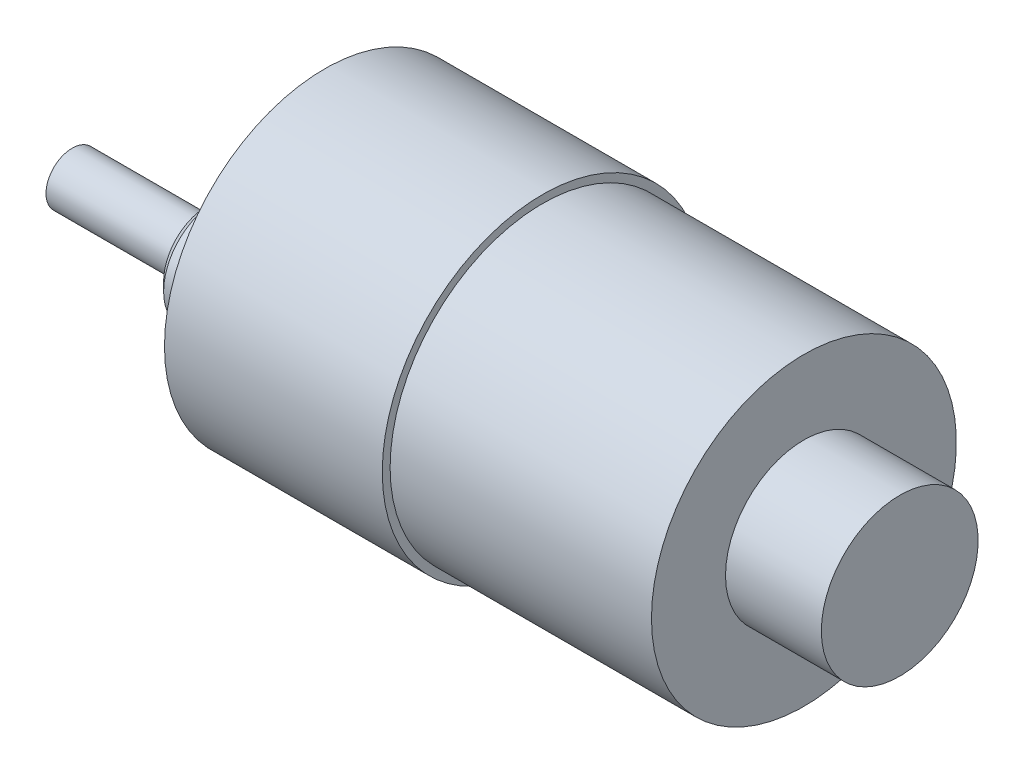
ISO-10303-21;
HEADER;
FILE_DESCRIPTION(('STEP AP214'),'2;1');
FILE_NAME('part.step','',(''),(''),'','','');
FILE_SCHEMA(('AUTOMOTIVE_DESIGN { 1 0 10303 214 1 1 1 1 }'));
ENDSEC;
DATA;
#1=APPLICATION_CONTEXT('core data for automotive mechanical design processes');
#2=APPLICATION_PROTOCOL_DEFINITION('international standard','automotive_design',2000,#1);
#3=PRODUCT_CONTEXT('',#1,'mechanical');
#4=PRODUCT('Part','Part','',(#3));
#5=PRODUCT_RELATED_PRODUCT_CATEGORY('part','',(#4));
#6=PRODUCT_DEFINITION_FORMATION('','',#4);
#7=PRODUCT_DEFINITION_CONTEXT('part definition',#1,'design');
#8=PRODUCT_DEFINITION('design','',#6,#7);
#9=PRODUCT_DEFINITION_SHAPE('','',#8);
#10=(LENGTH_UNIT() NAMED_UNIT(*) SI_UNIT(.MILLI.,.METRE.));
#11=(NAMED_UNIT(*) PLANE_ANGLE_UNIT() SI_UNIT($,.RADIAN.));
#12=(NAMED_UNIT(*) SI_UNIT($,.STERADIAN.) SOLID_ANGLE_UNIT());
#13=UNCERTAINTY_MEASURE_WITH_UNIT(LENGTH_MEASURE(1.E-05),#10,'distance_accuracy_value','');
#14=(GEOMETRIC_REPRESENTATION_CONTEXT(3) GLOBAL_UNCERTAINTY_ASSIGNED_CONTEXT((#13)) GLOBAL_UNIT_ASSIGNED_CONTEXT((#10,
#11,#12)) REPRESENTATION_CONTEXT('',''));
#15=CARTESIAN_POINT('',(0.,0.,0.));
#16=DIRECTION('',(0.,0.,1.));
#17=DIRECTION('',(1.,0.,0.));
#18=AXIS2_PLACEMENT_3D('',#15,#16,#17);
#19=CARTESIAN_POINT('',(0.,6.00000000001026,0.));
#20=DIRECTION('',(1.,0.,0.));
#21=DIRECTION('',(0.,0.,-1.));
#22=AXIS2_PLACEMENT_3D('',#19,#20,#21);
#23=PLANE('',#22);
#24=CARTESIAN_POINT('',(0.,15.5,0.));
#25=DIRECTION('',(-1.,0.,0.));
#26=DIRECTION('',(0.,0.,1.));
#27=AXIS2_PLACEMENT_3D('',#24,#25,#26);
#28=CIRCLE('',#27,1.24999999999999);
#29=CARTESIAN_POINT('',(0.,15.5,1.24999999999999));
#30=VERTEX_POINT('',#29);
#31=EDGE_CURVE('E94',#30,#30,#28,.T.);
#32=ORIENTED_EDGE('',*,*,#31,.F.);
#33=EDGE_LOOP('',(#32));
#34=FACE_BOUND('',#33,.T.);
#35=CARTESIAN_POINT('',(0.,-7.75,-13.4233937586588));
#36=DIRECTION('',(-1.,0.,0.));
#37=DIRECTION('',(0.,0.,1.));
#38=AXIS2_PLACEMENT_3D('',#35,#36,#37);
#39=CIRCLE('',#38,1.24999999999999);
#40=CARTESIAN_POINT('',(0.,-7.75,-12.1733937586588));
#41=VERTEX_POINT('',#40);
#42=EDGE_CURVE('E93',#41,#41,#39,.T.);
#43=ORIENTED_EDGE('',*,*,#42,.F.);
#44=EDGE_LOOP('',(#43));
#45=FACE_BOUND('',#44,.T.);
#46=CARTESIAN_POINT('',(0.,-15.5,0.));
#47=DIRECTION('',(-1.,0.,0.));
#48=DIRECTION('',(0.,0.,1.));
#49=AXIS2_PLACEMENT_3D('',#46,#47,#48);
#50=CIRCLE('',#49,1.24999999999999);
#51=CARTESIAN_POINT('',(0.,-15.5,1.24999999999999));
#52=VERTEX_POINT('',#51);
#53=EDGE_CURVE('E106',#52,#52,#50,.T.);
#54=ORIENTED_EDGE('',*,*,#53,.F.);
#55=EDGE_LOOP('',(#54));
#56=FACE_BOUND('',#55,.T.);
#57=CARTESIAN_POINT('',(0.,-7.75,13.4233937586588));
#58=DIRECTION('',(-1.,0.,0.));
#59=DIRECTION('',(0.,0.,1.));
#60=AXIS2_PLACEMENT_3D('',#57,#58,#59);
#61=CIRCLE('',#60,1.24999999999999);
#62=CARTESIAN_POINT('',(0.,-7.75,14.6733937586588));
#63=VERTEX_POINT('',#62);
#64=EDGE_CURVE('E112',#63,#63,#61,.T.);
#65=ORIENTED_EDGE('',*,*,#64,.F.);
#66=EDGE_LOOP('',(#65));
#67=FACE_BOUND('',#66,.T.);
#68=CARTESIAN_POINT('',(0.,7.75,-13.4233937586588));
#69=DIRECTION('',(-1.,0.,0.));
#70=DIRECTION('',(0.,0.,1.));
#71=AXIS2_PLACEMENT_3D('',#68,#69,#70);
#72=CIRCLE('',#71,1.24999999999999);
#73=CARTESIAN_POINT('',(0.,7.75,-12.1733937586588));
#74=VERTEX_POINT('',#73);
#75=EDGE_CURVE('E124',#74,#74,#72,.T.);
#76=ORIENTED_EDGE('',*,*,#75,.F.);
#77=EDGE_LOOP('',(#76));
#78=FACE_BOUND('',#77,.T.);
#79=CARTESIAN_POINT('',(0.,0.,7.));
#80=DIRECTION('',(1.,0.,0.));
#81=DIRECTION('',(0.,0.,-1.));
#82=AXIS2_PLACEMENT_3D('',#79,#80,#81);
#83=CIRCLE('',#82,6.);
#84=CARTESIAN_POINT('',(0.,0.,1.));
#85=VERTEX_POINT('',#84);
#86=EDGE_CURVE('E157',#85,#85,#83,.F.);
#87=ORIENTED_EDGE('',*,*,#86,.F.);
#88=EDGE_LOOP('',(#87));
#89=FACE_BOUND('',#88,.T.);
#90=CARTESIAN_POINT('',(0.,0.,0.));
#91=DIRECTION('',(-1.,0.,0.));
#92=DIRECTION('',(0.,0.,1.));
#93=AXIS2_PLACEMENT_3D('',#90,#91,#92);
#94=CIRCLE('',#93,18.4000000000103);
#95=CARTESIAN_POINT('',(0.,0.,18.4000000000103));
#96=VERTEX_POINT('',#95);
#97=EDGE_CURVE('E145',#96,#96,#94,.T.);
#98=ORIENTED_EDGE('',*,*,#97,.T.);
#99=EDGE_LOOP('',(#98));
#100=FACE_BOUND('',#99,.T.);
#101=CARTESIAN_POINT('',(0.,7.75000000000001,13.4233937586588));
#102=DIRECTION('',(-1.,0.,0.));
#103=DIRECTION('',(0.,0.,1.));
#104=AXIS2_PLACEMENT_3D('',#101,#102,#103);
#105=CIRCLE('',#104,1.24999999999999);
#106=CARTESIAN_POINT('',(0.,7.75000000000001,14.6733937586588));
#107=VERTEX_POINT('',#106);
#108=EDGE_CURVE('E118',#107,#107,#105,.T.);
#109=ORIENTED_EDGE('',*,*,#108,.F.);
#110=EDGE_LOOP('',(#109));
#111=FACE_BOUND('',#110,.T.);
#112=ADVANCED_FACE('F37',(#34,#45,#56,#67,#78,#89,#100,#111),#23,.F.);
#113=CARTESIAN_POINT('',(55.,0.,0.));
#114=DIRECTION('',(-1.,0.,0.));
#115=DIRECTION('',(0.,0.,1.));
#116=AXIS2_PLACEMENT_3D('',#113,#114,#115);
#117=PLANE('',#116);
#118=CARTESIAN_POINT('',(55.,0.,0.));
#119=DIRECTION('',(-1.,0.,0.));
#120=DIRECTION('',(0.,0.,1.));
#121=AXIS2_PLACEMENT_3D('',#118,#119,#120);
#122=CIRCLE('',#121,9.);
#123=CARTESIAN_POINT('',(55.,0.,9.));
#124=VERTEX_POINT('',#123);
#125=EDGE_CURVE('E11',#124,#124,#122,.F.);
#126=ORIENTED_EDGE('',*,*,#125,.F.);
#127=EDGE_LOOP('',(#126));
#128=FACE_BOUND('',#127,.T.);
#129=CARTESIAN_POINT('',(55.,0.,0.));
#130=DIRECTION('',(-1.,0.,0.));
#131=DIRECTION('',(0.,0.,1.));
#132=AXIS2_PLACEMENT_3D('',#129,#130,#131);
#133=CIRCLE('',#132,17.5000000000103);
#134=CARTESIAN_POINT('',(55.,0.,17.5000000000103));
#135=VERTEX_POINT('',#134);
#136=EDGE_CURVE('E154',#135,#135,#133,.T.);
#137=ORIENTED_EDGE('',*,*,#136,.F.);
#138=EDGE_LOOP('',(#137));
#139=FACE_BOUND('',#138,.T.);
#140=ADVANCED_FACE('F186',(#128,#139),#117,.F.);
#141=CARTESIAN_POINT('',(12.5,0.,0.));
#142=DIRECTION('',(-1.,0.,0.));
#143=DIRECTION('',(0.,0.,1.));
#144=AXIS2_PLACEMENT_3D('',#141,#142,#143);
#145=CYLINDRICAL_SURFACE('',#144,17.5000000000103);
#146=CARTESIAN_POINT('',(25.,0.,0.));
#147=DIRECTION('',(-1.,0.,0.));
#148=DIRECTION('',(0.,0.,1.));
#149=AXIS2_PLACEMENT_3D('',#146,#147,#148);
#150=CIRCLE('',#149,17.5000000000103);
#151=CARTESIAN_POINT('',(25.,0.,17.5000000000103));
#152=VERTEX_POINT('',#151);
#153=EDGE_CURVE('E151',#152,#152,#150,.T.);
#154=ORIENTED_EDGE('',*,*,#153,.F.);
#155=EDGE_LOOP('',(#154));
#156=FACE_BOUND('',#155,.T.);
#157=ORIENTED_EDGE('',*,*,#136,.T.);
#158=EDGE_LOOP('',(#157));
#159=FACE_BOUND('',#158,.T.);
#160=ADVANCED_FACE('F192',(#156,#159),#145,.T.);
#161=CARTESIAN_POINT('',(25.,17.5000000000103,0.));
#162=DIRECTION('',(-1.,0.,0.));
#163=DIRECTION('',(0.,0.,1.));
#164=AXIS2_PLACEMENT_3D('',#161,#162,#163);
#165=PLANE('',#164);
#166=CARTESIAN_POINT('',(25.,0.,0.));
#167=DIRECTION('',(-1.,0.,0.));
#168=DIRECTION('',(0.,0.,1.));
#169=AXIS2_PLACEMENT_3D('',#166,#167,#168);
#170=CIRCLE('',#169,18.4000000000103);
#171=CARTESIAN_POINT('',(25.,0.,18.4000000000103));
#172=VERTEX_POINT('',#171);
#173=EDGE_CURVE('E148',#172,#172,#170,.T.);
#174=ORIENTED_EDGE('',*,*,#173,.F.);
#175=EDGE_LOOP('',(#174));
#176=FACE_BOUND('',#175,.T.);
#177=ORIENTED_EDGE('',*,*,#153,.T.);
#178=EDGE_LOOP('',(#177));
#179=FACE_BOUND('',#178,.T.);
#180=ADVANCED_FACE('F203',(#176,#179),#165,.F.);
#181=CARTESIAN_POINT('',(12.5,0.,0.));
#182=DIRECTION('',(-1.,0.,0.));
#183=DIRECTION('',(0.,0.,1.));
#184=AXIS2_PLACEMENT_3D('',#181,#182,#183);
#185=CYLINDRICAL_SURFACE('',#184,18.4000000000103);
#186=ORIENTED_EDGE('',*,*,#97,.F.);
#187=EDGE_LOOP('',(#186));
#188=FACE_BOUND('',#187,.T.);
#189=ORIENTED_EDGE('',*,*,#173,.T.);
#190=EDGE_LOOP('',(#189));
#191=FACE_BOUND('',#190,.T.);
#192=ADVANCED_FACE('F200',(#188,#191),#185,.T.);
#193=CARTESIAN_POINT('',(-22.,0.,7.));
#194=DIRECTION('',(-1.,0.,0.));
#195=DIRECTION('',(0.,0.,1.));
#196=AXIS2_PLACEMENT_3D('',#193,#194,#195);
#197=PLANE('',#196);
#198=DIRECTION('',(0.,0.,1.));
#199=VECTOR('',#198,1.);
#200=CARTESIAN_POINT('',(-22.,-2.4,5.2));
#201=LINE('',#200,#199);
#202=CARTESIAN_POINT('',(-22.,-2.4,5.2));
#203=VERTEX_POINT('',#202);
#204=CARTESIAN_POINT('',(-22.,-2.4,8.8));
#205=VERTEX_POINT('',#204);
#206=EDGE_CURVE('E59',#203,#205,#201,.T.);
#207=ORIENTED_EDGE('',*,*,#206,.T.);
#208=CARTESIAN_POINT('',(-22.,0.,7.));
#209=DIRECTION('',(-1.,0.,0.));
#210=DIRECTION('',(0.,0.,1.));
#211=AXIS2_PLACEMENT_3D('',#208,#209,#210);
#212=CIRCLE('',#211,3.);
#213=EDGE_CURVE('E139',#205,#203,#212,.T.);
#214=ORIENTED_EDGE('',*,*,#213,.T.);
#215=EDGE_LOOP('',(#207,#214));
#216=FACE_BOUND('',#215,.T.);
#217=ADVANCED_FACE('F198',(#216),#197,.T.);
#218=CARTESIAN_POINT('',(0.,0.,7.));
#219=DIRECTION('',(-1.,0.,0.));
#220=DIRECTION('',(0.,0.,1.));
#221=AXIS2_PLACEMENT_3D('',#218,#219,#220);
#222=CYLINDRICAL_SURFACE('',#221,6.);
#223=CARTESIAN_POINT('',(-5.50000000000001,0.,7.));
#224=DIRECTION('',(-1.,0.,0.));
#225=DIRECTION('',(0.,0.,1.));
#226=AXIS2_PLACEMENT_3D('',#223,#224,#225);
#227=CIRCLE('',#226,6.);
#228=CARTESIAN_POINT('',(-5.50000000000001,0.,13.));
#229=VERTEX_POINT('',#228);
#230=EDGE_CURVE('E45',#229,#229,#227,.F.);
#231=ORIENTED_EDGE('',*,*,#230,.T.);
#232=EDGE_LOOP('',(#231));
#233=FACE_BOUND('',#232,.T.);
#234=ORIENTED_EDGE('',*,*,#86,.T.);
#235=EDGE_LOOP('',(#234));
#236=FACE_BOUND('',#235,.T.);
#237=ADVANCED_FACE('F165',(#233,#236),#222,.T.);
#238=CARTESIAN_POINT('',(-6.5,0.,7.));
#239=DIRECTION('',(-1.,0.,0.));
#240=DIRECTION('',(0.,0.,1.));
#241=AXIS2_PLACEMENT_3D('',#238,#239,#240);
#242=PLANE('',#241);
#243=CARTESIAN_POINT('',(-6.5,0.,7.));
#244=DIRECTION('',(-1.,0.,0.));
#245=DIRECTION('',(0.,0.,1.));
#246=AXIS2_PLACEMENT_3D('',#243,#244,#245);
#247=CIRCLE('',#246,5.00000000000002);
#248=CARTESIAN_POINT('',(-6.5,0.,12.));
#249=VERTEX_POINT('',#248);
#250=EDGE_CURVE('E160',#249,#249,#247,.T.);
#251=ORIENTED_EDGE('',*,*,#250,.T.);
#252=EDGE_LOOP('',(#251));
#253=FACE_BOUND('',#252,.T.);
#254=CARTESIAN_POINT('',(-6.5,0.,7.));
#255=DIRECTION('',(-1.,0.,0.));
#256=DIRECTION('',(0.,0.,1.));
#257=AXIS2_PLACEMENT_3D('',#254,#255,#256);
#258=CIRCLE('',#257,3.);
#259=CARTESIAN_POINT('',(-6.5,0.,10.));
#260=VERTEX_POINT('',#259);
#261=EDGE_CURVE('E142',#260,#260,#258,.T.);
#262=ORIENTED_EDGE('',*,*,#261,.F.);
#263=EDGE_LOOP('',(#262));
#264=FACE_BOUND('',#263,.T.);
#265=ADVANCED_FACE('F174',(#253,#264),#242,.T.);
#266=CARTESIAN_POINT('',(0.,0.,7.));
#267=DIRECTION('',(-1.,0.,0.));
#268=DIRECTION('',(0.,0.,1.));
#269=AXIS2_PLACEMENT_3D('',#266,#267,#268);
#270=CYLINDRICAL_SURFACE('',#269,3.);
#271=CARTESIAN_POINT('',(-10.,0.,7.));
#272=DIRECTION('',(-1.,0.,0.));
#273=DIRECTION('',(0.,0.,1.));
#274=AXIS2_PLACEMENT_3D('',#271,#272,#273);
#275=CIRCLE('',#274,3.);
#276=CARTESIAN_POINT('',(-10.,-2.4,5.2));
#277=VERTEX_POINT('',#276);
#278=CARTESIAN_POINT('',(-10.,-2.4,8.8));
#279=VERTEX_POINT('',#278);
#280=EDGE_CURVE('E52',#277,#279,#275,.T.);
#281=ORIENTED_EDGE('',*,*,#280,.F.);
#282=DIRECTION('',(1.,0.,0.));
#283=VECTOR('',#282,1.);
#284=CARTESIAN_POINT('',(-234.422554848401,-2.4,5.2));
#285=LINE('',#284,#283);
#286=EDGE_CURVE('E135',#203,#277,#285,.T.);
#287=ORIENTED_EDGE('',*,*,#286,.F.);
#288=ORIENTED_EDGE('',*,*,#213,.F.);
#289=DIRECTION('',(1.,0.,0.));
#290=VECTOR('',#289,1.);
#291=CARTESIAN_POINT('',(-234.422554848401,-2.4,8.8));
#292=LINE('',#291,#290);
#293=EDGE_CURVE('E133',#205,#279,#292,.T.);
#294=ORIENTED_EDGE('',*,*,#293,.T.);
#295=EDGE_LOOP('',(#281,#287,#288,#294));
#296=FACE_BOUND('',#295,.T.);
#297=ORIENTED_EDGE('',*,*,#261,.T.);
#298=EDGE_LOOP('',(#297));
#299=FACE_BOUND('',#298,.T.);
#300=ADVANCED_FACE('F171',(#296,#299),#270,.T.);
#301=CARTESIAN_POINT('',(-6.5,0.,7.));
#302=DIRECTION('',(1.,0.,0.));
#303=DIRECTION('',(0.,0.,-1.));
#304=AXIS2_PLACEMENT_3D('',#301,#302,#303);
#305=CONICAL_SURFACE('',#304,5.00000000000002,0.785398163397445);
#306=ORIENTED_EDGE('',*,*,#230,.F.);
#307=EDGE_LOOP('',(#306));
#308=FACE_BOUND('',#307,.T.);
#309=ORIENTED_EDGE('',*,*,#250,.F.);
#310=EDGE_LOOP('',(#309));
#311=FACE_BOUND('',#310,.T.);
#312=ADVANCED_FACE('F39',(#308,#311),#305,.T.);
#313=CARTESIAN_POINT('',(-234.422554848401,-2.4,5.2));
#314=DIRECTION('',(0.,1.,0.));
#315=DIRECTION('',(0.,0.,1.));
#316=AXIS2_PLACEMENT_3D('',#313,#314,#315);
#317=PLANE('',#316);
#318=ORIENTED_EDGE('',*,*,#286,.T.);
#319=DIRECTION('',(0.,0.,1.));
#320=VECTOR('',#319,1.);
#321=CARTESIAN_POINT('',(-10.,-2.4,5.2));
#322=LINE('',#321,#320);
#323=EDGE_CURVE('E130',#277,#279,#322,.T.);
#324=ORIENTED_EDGE('',*,*,#323,.T.);
#325=ORIENTED_EDGE('',*,*,#293,.F.);
#326=ORIENTED_EDGE('',*,*,#206,.F.);
#327=EDGE_LOOP('',(#318,#324,#325,#326));
#328=FACE_BOUND('',#327,.T.);
#329=ADVANCED_FACE('F170',(#328),#317,.F.);
#330=CARTESIAN_POINT('',(-10.,0.,7.));
#331=DIRECTION('',(-1.,0.,0.));
#332=DIRECTION('',(0.,0.,1.));
#333=AXIS2_PLACEMENT_3D('',#330,#331,#332);
#334=PLANE('',#333);
#335=ORIENTED_EDGE('',*,*,#280,.T.);
#336=ORIENTED_EDGE('',*,*,#323,.F.);
#337=EDGE_LOOP('',(#335,#336));
#338=FACE_BOUND('',#337,.T.);
#339=ADVANCED_FACE('F258',(#338),#334,.T.);
#340=CARTESIAN_POINT('',(15.,7.75,-13.4233937586588));
#341=DIRECTION('',(-1.,0.,0.));
#342=DIRECTION('',(0.,0.,1.));
#343=AXIS2_PLACEMENT_3D('',#340,#341,#342);
#344=CONICAL_SURFACE('',#343,1.24999999999999,1.02974425867665);
#345=CARTESIAN_POINT('',(15.7510757737845,7.74999999999999,-13.4233937586588));
#346=VERTEX_POINT('',#345);
#347=VERTEX_LOOP('',#346);
#348=FACE_BOUND('',#347,.T.);
#349=CARTESIAN_POINT('',(15.,7.75,-13.4233937586588));
#350=DIRECTION('',(-1.,0.,0.));
#351=DIRECTION('',(0.,0.,1.));
#352=AXIS2_PLACEMENT_3D('',#349,#350,#351);
#353=CIRCLE('',#352,1.24999999999999);
#354=CARTESIAN_POINT('',(15.,7.75,-12.1733937586588));
#355=VERTEX_POINT('',#354);
#356=EDGE_CURVE('E127',#355,#355,#353,.T.);
#357=ORIENTED_EDGE('',*,*,#356,.T.);
#358=EDGE_LOOP('',(#357));
#359=FACE_BOUND('',#358,.T.);
#360=ADVANCED_FACE('F265',(#348,#359),#344,.F.);
#361=CARTESIAN_POINT('',(0.,7.75,-13.4233937586588));
#362=DIRECTION('',(-1.,0.,0.));
#363=DIRECTION('',(0.,0.,1.));
#364=AXIS2_PLACEMENT_3D('',#361,#362,#363);
#365=CYLINDRICAL_SURFACE('',#364,1.24999999999999);
#366=ORIENTED_EDGE('',*,*,#356,.F.);
#367=EDGE_LOOP('',(#366));
#368=FACE_BOUND('',#367,.T.);
#369=ORIENTED_EDGE('',*,*,#75,.T.);
#370=EDGE_LOOP('',(#369));
#371=FACE_BOUND('',#370,.T.);
#372=ADVANCED_FACE('F272',(#368,#371),#365,.F.);
#373=CARTESIAN_POINT('',(15.,7.75000000000001,13.4233937586588));
#374=DIRECTION('',(-1.,0.,0.));
#375=DIRECTION('',(0.,0.,1.));
#376=AXIS2_PLACEMENT_3D('',#373,#374,#375);
#377=CONICAL_SURFACE('',#376,1.24999999999999,1.02974425867665);
#378=CARTESIAN_POINT('',(15.7510757737845,7.75,13.4233937586588));
#379=VERTEX_POINT('',#378);
#380=VERTEX_LOOP('',#379);
#381=FACE_BOUND('',#380,.T.);
#382=CARTESIAN_POINT('',(15.,7.75000000000001,13.4233937586588));
#383=DIRECTION('',(-1.,0.,0.));
#384=DIRECTION('',(0.,0.,1.));
#385=AXIS2_PLACEMENT_3D('',#382,#383,#384);
#386=CIRCLE('',#385,1.24999999999999);
#387=CARTESIAN_POINT('',(15.,7.75000000000001,14.6733937586588));
#388=VERTEX_POINT('',#387);
#389=EDGE_CURVE('E121',#388,#388,#386,.T.);
#390=ORIENTED_EDGE('',*,*,#389,.T.);
#391=EDGE_LOOP('',(#390));
#392=FACE_BOUND('',#391,.T.);
#393=ADVANCED_FACE('F280',(#381,#392),#377,.F.);
#394=CARTESIAN_POINT('',(0.,7.75000000000001,13.4233937586588));
#395=DIRECTION('',(-1.,0.,0.));
#396=DIRECTION('',(0.,0.,1.));
#397=AXIS2_PLACEMENT_3D('',#394,#395,#396);
#398=CYLINDRICAL_SURFACE('',#397,1.24999999999999);
#399=ORIENTED_EDGE('',*,*,#389,.F.);
#400=EDGE_LOOP('',(#399));
#401=FACE_BOUND('',#400,.T.);
#402=ORIENTED_EDGE('',*,*,#108,.T.);
#403=EDGE_LOOP('',(#402));
#404=FACE_BOUND('',#403,.T.);
#405=ADVANCED_FACE('F288',(#401,#404),#398,.F.);
#406=CARTESIAN_POINT('',(15.,-7.75,13.4233937586588));
#407=DIRECTION('',(-1.,0.,0.));
#408=DIRECTION('',(0.,0.,1.));
#409=AXIS2_PLACEMENT_3D('',#406,#407,#408);
#410=CONICAL_SURFACE('',#409,1.24999999999999,1.02974425867665);
#411=CARTESIAN_POINT('',(15.7510757737845,-7.75,13.4233937586588));
#412=VERTEX_POINT('',#411);
#413=VERTEX_LOOP('',#412);
#414=FACE_BOUND('',#413,.T.);
#415=CARTESIAN_POINT('',(15.,-7.75,13.4233937586588));
#416=DIRECTION('',(-1.,0.,0.));
#417=DIRECTION('',(0.,0.,1.));
#418=AXIS2_PLACEMENT_3D('',#415,#416,#417);
#419=CIRCLE('',#418,1.24999999999999);
#420=CARTESIAN_POINT('',(15.,-7.75,14.6733937586588));
#421=VERTEX_POINT('',#420);
#422=EDGE_CURVE('E115',#421,#421,#419,.T.);
#423=ORIENTED_EDGE('',*,*,#422,.T.);
#424=EDGE_LOOP('',(#423));
#425=FACE_BOUND('',#424,.T.);
#426=ADVANCED_FACE('F296',(#414,#425),#410,.F.);
#427=CARTESIAN_POINT('',(0.,-7.75,13.4233937586588));
#428=DIRECTION('',(-1.,0.,0.));
#429=DIRECTION('',(0.,0.,1.));
#430=AXIS2_PLACEMENT_3D('',#427,#428,#429);
#431=CYLINDRICAL_SURFACE('',#430,1.24999999999999);
#432=ORIENTED_EDGE('',*,*,#422,.F.);
#433=EDGE_LOOP('',(#432));
#434=FACE_BOUND('',#433,.T.);
#435=ORIENTED_EDGE('',*,*,#64,.T.);
#436=EDGE_LOOP('',(#435));
#437=FACE_BOUND('',#436,.T.);
#438=ADVANCED_FACE('F304',(#434,#437),#431,.F.);
#439=CARTESIAN_POINT('',(15.,-15.5,0.));
#440=DIRECTION('',(-1.,0.,0.));
#441=DIRECTION('',(0.,0.,1.));
#442=AXIS2_PLACEMENT_3D('',#439,#440,#441);
#443=CONICAL_SURFACE('',#442,1.24999999999999,1.02974425867665);
#444=CARTESIAN_POINT('',(15.7510757737845,-15.5,0.));
#445=VERTEX_POINT('',#444);
#446=VERTEX_LOOP('',#445);
#447=FACE_BOUND('',#446,.T.);
#448=CARTESIAN_POINT('',(15.,-15.5,0.));
#449=DIRECTION('',(-1.,0.,0.));
#450=DIRECTION('',(0.,0.,1.));
#451=AXIS2_PLACEMENT_3D('',#448,#449,#450);
#452=CIRCLE('',#451,1.24999999999999);
#453=CARTESIAN_POINT('',(15.,-15.5,1.24999999999999));
#454=VERTEX_POINT('',#453);
#455=EDGE_CURVE('E109',#454,#454,#452,.T.);
#456=ORIENTED_EDGE('',*,*,#455,.T.);
#457=EDGE_LOOP('',(#456));
#458=FACE_BOUND('',#457,.T.);
#459=ADVANCED_FACE('F312',(#447,#458),#443,.F.);
#460=CARTESIAN_POINT('',(0.,-15.5,0.));
#461=DIRECTION('',(-1.,0.,0.));
#462=DIRECTION('',(0.,0.,1.));
#463=AXIS2_PLACEMENT_3D('',#460,#461,#462);
#464=CYLINDRICAL_SURFACE('',#463,1.24999999999999);
#465=ORIENTED_EDGE('',*,*,#455,.F.);
#466=EDGE_LOOP('',(#465));
#467=FACE_BOUND('',#466,.T.);
#468=ORIENTED_EDGE('',*,*,#53,.T.);
#469=EDGE_LOOP('',(#468));
#470=FACE_BOUND('',#469,.T.);
#471=ADVANCED_FACE('F320',(#467,#470),#464,.F.);
#472=CARTESIAN_POINT('',(15.,-7.75,-13.4233937586588));
#473=DIRECTION('',(-1.,0.,0.));
#474=DIRECTION('',(0.,0.,1.));
#475=AXIS2_PLACEMENT_3D('',#472,#473,#474);
#476=CONICAL_SURFACE('',#475,1.24999999999999,1.02974425867665);
#477=CARTESIAN_POINT('',(15.7510757737845,-7.75000000000001,-13.4233937586588));
#478=VERTEX_POINT('',#477);
#479=VERTEX_LOOP('',#478);
#480=FACE_BOUND('',#479,.T.);
#481=CARTESIAN_POINT('',(15.,-7.75,-13.4233937586588));
#482=DIRECTION('',(-1.,0.,0.));
#483=DIRECTION('',(0.,0.,1.));
#484=AXIS2_PLACEMENT_3D('',#481,#482,#483);
#485=CIRCLE('',#484,1.24999999999999);
#486=CARTESIAN_POINT('',(15.,-7.75,-12.1733937586588));
#487=VERTEX_POINT('',#486);
#488=EDGE_CURVE('E97',#487,#487,#485,.T.);
#489=ORIENTED_EDGE('',*,*,#488,.T.);
#490=EDGE_LOOP('',(#489));
#491=FACE_BOUND('',#490,.T.);
#492=ADVANCED_FACE('F328',(#480,#491),#476,.F.);
#493=CARTESIAN_POINT('',(0.,-7.75,-13.4233937586588));
#494=DIRECTION('',(-1.,0.,0.));
#495=DIRECTION('',(0.,0.,1.));
#496=AXIS2_PLACEMENT_3D('',#493,#494,#495);
#497=CYLINDRICAL_SURFACE('',#496,1.24999999999999);
#498=ORIENTED_EDGE('',*,*,#488,.F.);
#499=EDGE_LOOP('',(#498));
#500=FACE_BOUND('',#499,.T.);
#501=ORIENTED_EDGE('',*,*,#42,.T.);
#502=EDGE_LOOP('',(#501));
#503=FACE_BOUND('',#502,.T.);
#504=ADVANCED_FACE('F87',(#500,#503),#497,.F.);
#505=CARTESIAN_POINT('',(15.,15.5,0.));
#506=DIRECTION('',(-1.,0.,0.));
#507=DIRECTION('',(0.,0.,1.));
#508=AXIS2_PLACEMENT_3D('',#505,#506,#507);
#509=CONICAL_SURFACE('',#508,1.24999999999999,1.02974425867665);
#510=CARTESIAN_POINT('',(15.7510757737845,15.5,0.));
#511=VERTEX_POINT('',#510);
#512=VERTEX_LOOP('',#511);
#513=FACE_BOUND('',#512,.T.);
#514=CARTESIAN_POINT('',(15.,15.5,0.));
#515=DIRECTION('',(-1.,0.,0.));
#516=DIRECTION('',(0.,0.,1.));
#517=AXIS2_PLACEMENT_3D('',#514,#515,#516);
#518=CIRCLE('',#517,1.24999999999999);
#519=CARTESIAN_POINT('',(15.,15.5,1.25));
#520=VERTEX_POINT('',#519);
#521=EDGE_CURVE('E91',#520,#520,#518,.T.);
#522=ORIENTED_EDGE('',*,*,#521,.T.);
#523=EDGE_LOOP('',(#522));
#524=FACE_BOUND('',#523,.T.);
#525=ADVANCED_FACE('F83',(#513,#524),#509,.F.);
#526=CARTESIAN_POINT('',(0.,15.5,0.));
#527=DIRECTION('',(-1.,0.,0.));
#528=DIRECTION('',(0.,0.,1.));
#529=AXIS2_PLACEMENT_3D('',#526,#527,#528);
#530=CYLINDRICAL_SURFACE('',#529,1.24999999999999);
#531=ORIENTED_EDGE('',*,*,#521,.F.);
#532=EDGE_LOOP('',(#531));
#533=FACE_BOUND('',#532,.T.);
#534=ORIENTED_EDGE('',*,*,#31,.T.);
#535=EDGE_LOOP('',(#534));
#536=FACE_BOUND('',#535,.T.);
#537=ADVANCED_FACE('F86',(#533,#536),#530,.F.);
#538=CARTESIAN_POINT('',(0.,0.,0.));
#539=DIRECTION('',(-1.,0.,0.));
#540=DIRECTION('',(0.,0.,1.));
#541=AXIS2_PLACEMENT_3D('',#538,#539,#540);
#542=CYLINDRICAL_SURFACE('',#541,9.);
#543=ORIENTED_EDGE('',*,*,#125,.T.);
#544=EDGE_LOOP('',(#543));
#545=FACE_BOUND('',#544,.T.);
#546=CARTESIAN_POINT('',(66.,0.,0.));
#547=DIRECTION('',(-1.,0.,0.));
#548=DIRECTION('',(0.,0.,1.));
#549=AXIS2_PLACEMENT_3D('',#546,#547,#548);
#550=CIRCLE('',#549,9.);
#551=CARTESIAN_POINT('',(66.,0.,9.));
#552=VERTEX_POINT('',#551);
#553=EDGE_CURVE('E100',#552,#552,#550,.T.);
#554=ORIENTED_EDGE('',*,*,#553,.T.);
#555=EDGE_LOOP('',(#554));
#556=FACE_BOUND('',#555,.T.);
#557=ADVANCED_FACE('F354',(#545,#556),#542,.T.);
#558=CARTESIAN_POINT('',(66.,0.,0.));
#559=DIRECTION('',(-1.,0.,0.));
#560=DIRECTION('',(0.,0.,1.));
#561=AXIS2_PLACEMENT_3D('',#558,#559,#560);
#562=PLANE('',#561);
#563=ORIENTED_EDGE('',*,*,#553,.F.);
#564=EDGE_LOOP('',(#563));
#565=FACE_BOUND('',#564,.T.);
#566=ADVANCED_FACE('F361',(#565),#562,.F.);
#567=CLOSED_SHELL('',(#112,#140,#160,#180,#192,#217,#237,#265,#300,#312,#329,#339,#360,#372,
#393,#405,#426,#438,#459,#471,#492,#504,#525,#537,#557,#566));
#568=MANIFOLD_SOLID_BREP('B2',#567);
#569=ADVANCED_BREP_SHAPE_REPRESENTATION('',(#18,#568),#14);
#570=SHAPE_DEFINITION_REPRESENTATION(#9,#569);
ENDSEC;
END-ISO-10303-21;
